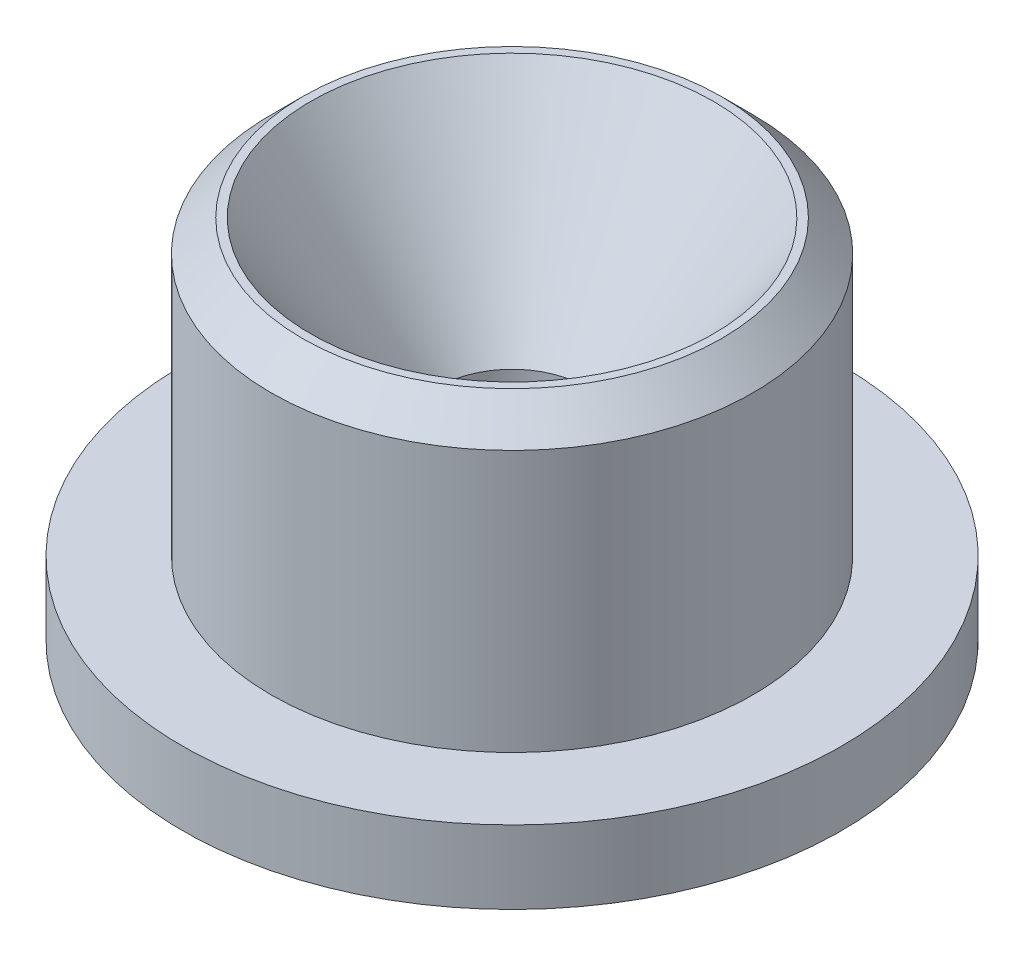
ISO-10303-21;
HEADER;
FILE_DESCRIPTION(('STEP AP214'),'2;1');
FILE_NAME('part.step','',(''),(''),'','','');
FILE_SCHEMA(('AUTOMOTIVE_DESIGN { 1 0 10303 214 1 1 1 1 }'));
ENDSEC;
DATA;
#1=APPLICATION_CONTEXT('core data for automotive mechanical design processes');
#2=APPLICATION_PROTOCOL_DEFINITION('international standard','automotive_design',2000,#1);
#3=PRODUCT_CONTEXT('',#1,'mechanical');
#4=PRODUCT('Part','Part','',(#3));
#5=PRODUCT_RELATED_PRODUCT_CATEGORY('part','',(#4));
#6=PRODUCT_DEFINITION_FORMATION('','',#4);
#7=PRODUCT_DEFINITION_CONTEXT('part definition',#1,'design');
#8=PRODUCT_DEFINITION('design','',#6,#7);
#9=PRODUCT_DEFINITION_SHAPE('','',#8);
#10=(LENGTH_UNIT() NAMED_UNIT(*) SI_UNIT(.MILLI.,.METRE.));
#11=(NAMED_UNIT(*) PLANE_ANGLE_UNIT() SI_UNIT($,.RADIAN.));
#12=(NAMED_UNIT(*) SI_UNIT($,.STERADIAN.) SOLID_ANGLE_UNIT());
#13=UNCERTAINTY_MEASURE_WITH_UNIT(LENGTH_MEASURE(1.E-05),#10,'distance_accuracy_value','');
#14=(GEOMETRIC_REPRESENTATION_CONTEXT(3) GLOBAL_UNCERTAINTY_ASSIGNED_CONTEXT((#13)) GLOBAL_UNIT_ASSIGNED_CONTEXT((#10,
#11,#12)) REPRESENTATION_CONTEXT('',''));
#15=CARTESIAN_POINT('',(0.,0.,0.));
#16=DIRECTION('',(0.,0.,1.));
#17=DIRECTION('',(1.,0.,0.));
#18=AXIS2_PLACEMENT_3D('',#15,#16,#17);
#19=CARTESIAN_POINT('',(0.,8.,0.));
#20=DIRECTION('',(0.,-1.,0.));
#21=DIRECTION('',(0.,0.,-1.));
#22=AXIS2_PLACEMENT_3D('',#19,#20,#21);
#23=PLANE('',#22);
#24=CARTESIAN_POINT('',(0.,8.,0.));
#25=DIRECTION('',(0.,-1.,0.));
#26=DIRECTION('',(0.,0.,-1.));
#27=AXIS2_PLACEMENT_3D('',#24,#25,#26);
#28=CIRCLE('',#27,5.5);
#29=CARTESIAN_POINT('',(0.,8.,-5.5));
#30=VERTEX_POINT('',#29);
#31=EDGE_CURVE('E64',#30,#30,#28,.T.);
#32=ORIENTED_EDGE('',*,*,#31,.T.);
#33=EDGE_LOOP('',(#32));
#34=FACE_BOUND('',#33,.T.);
#35=CARTESIAN_POINT('',(0.,8.,0.));
#36=DIRECTION('',(0.,-1.,0.));
#37=DIRECTION('',(0.,0.,-1.));
#38=AXIS2_PLACEMENT_3D('',#35,#36,#37);
#39=CIRCLE('',#38,5.7225);
#40=CARTESIAN_POINT('',(0.,8.,-5.7225));
#41=VERTEX_POINT('',#40);
#42=EDGE_CURVE('E78',#41,#41,#39,.T.);
#43=ORIENTED_EDGE('',*,*,#42,.F.);
#44=EDGE_LOOP('',(#43));
#45=FACE_BOUND('',#44,.T.);
#46=ADVANCED_FACE('F46',(#34,#45),#23,.F.);
#47=CARTESIAN_POINT('',(0.,0.,0.));
#48=DIRECTION('',(0.,-1.,0.));
#49=DIRECTION('',(0.,0.,-1.));
#50=AXIS2_PLACEMENT_3D('',#47,#48,#49);
#51=CYLINDRICAL_SURFACE('',#50,2.);
#52=CARTESIAN_POINT('',(0.,3.,0.));
#53=DIRECTION('',(0.,-1.,0.));
#54=DIRECTION('',(0.,0.,-1.));
#55=AXIS2_PLACEMENT_3D('',#52,#53,#54);
#56=CIRCLE('',#55,2.);
#57=CARTESIAN_POINT('',(0.,3.,-2.));
#58=VERTEX_POINT('',#57);
#59=EDGE_CURVE('E70',#58,#58,#56,.T.);
#60=ORIENTED_EDGE('',*,*,#59,.F.);
#61=EDGE_LOOP('',(#60));
#62=FACE_BOUND('',#61,.T.);
#63=CARTESIAN_POINT('',(0.,-2.,0.));
#64=DIRECTION('',(0.,-1.,0.));
#65=DIRECTION('',(0.,0.,-1.));
#66=AXIS2_PLACEMENT_3D('',#63,#64,#65);
#67=CIRCLE('',#66,2.);
#68=CARTESIAN_POINT('',(0.,-2.,-2.));
#69=VERTEX_POINT('',#68);
#70=EDGE_CURVE('E10',#69,#69,#67,.T.);
#71=ORIENTED_EDGE('',*,*,#70,.T.);
#72=EDGE_LOOP('',(#71));
#73=FACE_BOUND('',#72,.T.);
#74=ADVANCED_FACE('F48',(#62,#73),#51,.F.);
#75=CARTESIAN_POINT('',(0.,-2.,0.));
#76=DIRECTION('',(0.,-1.,0.));
#77=DIRECTION('',(0.,0.,-1.));
#78=AXIS2_PLACEMENT_3D('',#75,#76,#77);
#79=PLANE('',#78);
#80=CARTESIAN_POINT('',(0.,-2.,0.));
#81=DIRECTION('',(0.,-1.,0.));
#82=DIRECTION('',(0.,0.,-1.));
#83=AXIS2_PLACEMENT_3D('',#80,#81,#82);
#84=CIRCLE('',#83,9.);
#85=CARTESIAN_POINT('',(0.,-2.,-9.));
#86=VERTEX_POINT('',#85);
#87=EDGE_CURVE('E54',#86,#86,#84,.T.);
#88=ORIENTED_EDGE('',*,*,#87,.T.);
#89=EDGE_LOOP('',(#88));
#90=FACE_BOUND('',#89,.T.);
#91=ORIENTED_EDGE('',*,*,#70,.F.);
#92=EDGE_LOOP('',(#91));
#93=FACE_BOUND('',#92,.T.);
#94=ADVANCED_FACE('F101',(#90,#93),#79,.T.);
#95=CARTESIAN_POINT('',(0.,0.,0.));
#96=DIRECTION('',(0.,-1.,0.));
#97=DIRECTION('',(0.,0.,-1.));
#98=AXIS2_PLACEMENT_3D('',#95,#96,#97);
#99=CYLINDRICAL_SURFACE('',#98,9.);
#100=ORIENTED_EDGE('',*,*,#87,.F.);
#101=EDGE_LOOP('',(#100));
#102=FACE_BOUND('',#101,.T.);
#103=CARTESIAN_POINT('',(0.,0.,0.));
#104=DIRECTION('',(0.,-1.,0.));
#105=DIRECTION('',(0.,0.,-1.));
#106=AXIS2_PLACEMENT_3D('',#103,#104,#105);
#107=CIRCLE('',#106,9.);
#108=CARTESIAN_POINT('',(0.,0.,-9.));
#109=VERTEX_POINT('',#108);
#110=EDGE_CURVE('E59',#109,#109,#107,.T.);
#111=ORIENTED_EDGE('',*,*,#110,.T.);
#112=EDGE_LOOP('',(#111));
#113=FACE_BOUND('',#112,.T.);
#114=ADVANCED_FACE('F110',(#102,#113),#99,.T.);
#115=CARTESIAN_POINT('',(0.,0.,0.));
#116=DIRECTION('',(0.,-1.,0.));
#117=DIRECTION('',(0.,0.,-1.));
#118=AXIS2_PLACEMENT_3D('',#115,#116,#117);
#119=PLANE('',#118);
#120=ORIENTED_EDGE('',*,*,#110,.F.);
#121=EDGE_LOOP('',(#120));
#122=FACE_BOUND('',#121,.T.);
#123=CARTESIAN_POINT('',(0.,0.,0.));
#124=DIRECTION('',(0.,-1.,0.));
#125=DIRECTION('',(0.,0.,-1.));
#126=AXIS2_PLACEMENT_3D('',#123,#124,#125);
#127=CIRCLE('',#126,6.5785);
#128=CARTESIAN_POINT('',(0.,0.,-6.5785));
#129=VERTEX_POINT('',#128);
#130=EDGE_CURVE('E74',#129,#129,#127,.T.);
#131=ORIENTED_EDGE('',*,*,#130,.T.);
#132=EDGE_LOOP('',(#131));
#133=FACE_BOUND('',#132,.T.);
#134=ADVANCED_FACE('F107',(#122,#133),#119,.F.);
#135=CARTESIAN_POINT('',(0.,3.,0.));
#136=DIRECTION('',(0.,1.,0.));
#137=DIRECTION('',(0.,0.,1.));
#138=AXIS2_PLACEMENT_3D('',#135,#136,#137);
#139=CONICAL_SURFACE('',#138,2.,0.610725964389209);
#140=ORIENTED_EDGE('',*,*,#31,.F.);
#141=EDGE_LOOP('',(#140));
#142=FACE_BOUND('',#141,.T.);
#143=ORIENTED_EDGE('',*,*,#59,.T.);
#144=EDGE_LOOP('',(#143));
#145=FACE_BOUND('',#144,.T.);
#146=ADVANCED_FACE('F105',(#142,#145),#139,.F.);
#147=CARTESIAN_POINT('',(0.,8.,0.));
#148=DIRECTION('',(0.,-1.,0.));
#149=DIRECTION('',(0.,0.,-1.));
#150=AXIS2_PLACEMENT_3D('',#147,#148,#149);
#151=CYLINDRICAL_SURFACE('',#150,6.5785);
#152=ORIENTED_EDGE('',*,*,#130,.F.);
#153=EDGE_LOOP('',(#152));
#154=FACE_BOUND('',#153,.T.);
#155=CARTESIAN_POINT('',(0.,7.144,0.));
#156=DIRECTION('',(0.,-1.,0.));
#157=DIRECTION('',(0.,0.,-1.));
#158=AXIS2_PLACEMENT_3D('',#155,#156,#157);
#159=CIRCLE('',#158,6.5785);
#160=CARTESIAN_POINT('',(0.,7.144,-6.5785));
#161=VERTEX_POINT('',#160);
#162=EDGE_CURVE('E82',#161,#161,#159,.T.);
#163=ORIENTED_EDGE('',*,*,#162,.T.);
#164=EDGE_LOOP('',(#163));
#165=FACE_BOUND('',#164,.T.);
#166=ADVANCED_FACE('F87',(#154,#165),#151,.T.);
#167=CARTESIAN_POINT('',(0.,8.,0.));
#168=DIRECTION('',(0.,-1.,0.));
#169=DIRECTION('',(0.,0.,-1.));
#170=AXIS2_PLACEMENT_3D('',#167,#168,#169);
#171=CONICAL_SURFACE('',#170,5.7225,0.785398163397449);
#172=ORIENTED_EDGE('',*,*,#162,.F.);
#173=EDGE_LOOP('',(#172));
#174=FACE_BOUND('',#173,.T.);
#175=ORIENTED_EDGE('',*,*,#42,.T.);
#176=EDGE_LOOP('',(#175));
#177=FACE_BOUND('',#176,.T.);
#178=ADVANCED_FACE('F89',(#174,#177),#171,.T.);
#179=CLOSED_SHELL('',(#46,#74,#94,#114,#134,#146,#166,#178));
#180=MANIFOLD_SOLID_BREP('B2',#179);
#181=ADVANCED_BREP_SHAPE_REPRESENTATION('',(#18,#180),#14);
#182=SHAPE_DEFINITION_REPRESENTATION(#9,#181);
ENDSEC;
END-ISO-10303-21;
